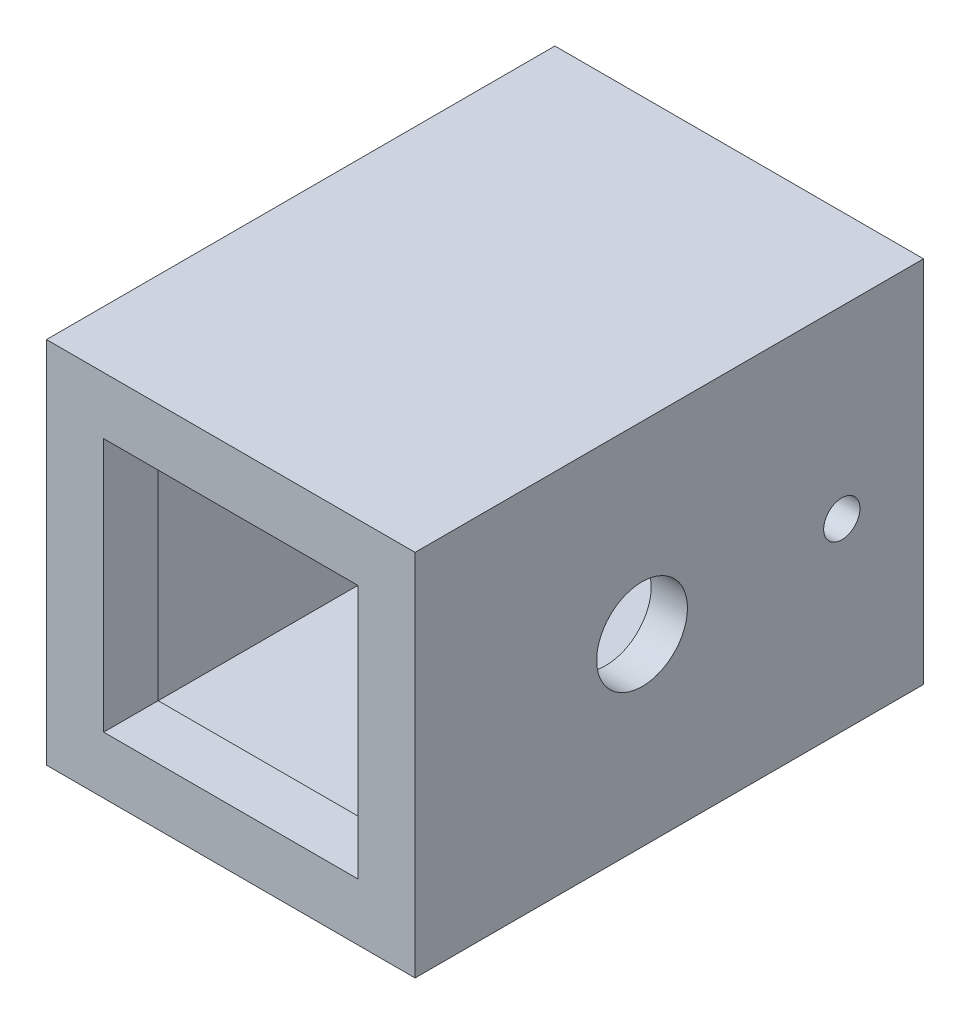
ISO-10303-21;
HEADER;
FILE_DESCRIPTION(('STEP AP214'),'2;1');
FILE_NAME('part.step','',(''),(''),'','','');
FILE_SCHEMA(('AUTOMOTIVE_DESIGN { 1 0 10303 214 1 1 1 1 }'));
ENDSEC;
DATA;
#1=APPLICATION_CONTEXT('core data for automotive mechanical design processes');
#2=APPLICATION_PROTOCOL_DEFINITION('international standard','automotive_design',2000,#1);
#3=PRODUCT_CONTEXT('',#1,'mechanical');
#4=PRODUCT('Part','Part','',(#3));
#5=PRODUCT_RELATED_PRODUCT_CATEGORY('part','',(#4));
#6=PRODUCT_DEFINITION_FORMATION('','',#4);
#7=PRODUCT_DEFINITION_CONTEXT('part definition',#1,'design');
#8=PRODUCT_DEFINITION('design','',#6,#7);
#9=PRODUCT_DEFINITION_SHAPE('','',#8);
#10=(LENGTH_UNIT() NAMED_UNIT(*) SI_UNIT(.MILLI.,.METRE.));
#11=(NAMED_UNIT(*) PLANE_ANGLE_UNIT() SI_UNIT($,.RADIAN.));
#12=(NAMED_UNIT(*) SI_UNIT($,.STERADIAN.) SOLID_ANGLE_UNIT());
#13=UNCERTAINTY_MEASURE_WITH_UNIT(LENGTH_MEASURE(1.E-05),#10,'distance_accuracy_value','');
#14=(GEOMETRIC_REPRESENTATION_CONTEXT(3) GLOBAL_UNCERTAINTY_ASSIGNED_CONTEXT((#13)) GLOBAL_UNIT_ASSIGNED_CONTEXT((#10,
#11,#12)) REPRESENTATION_CONTEXT('',''));
#15=CARTESIAN_POINT('',(0.,0.,0.));
#16=DIRECTION('',(0.,0.,1.));
#17=DIRECTION('',(1.,0.,0.));
#18=AXIS2_PLACEMENT_3D('',#15,#16,#17);
#19=CARTESIAN_POINT('',(10.15,-10.15,-25.));
#20=DIRECTION('',(1.,0.,0.));
#21=DIRECTION('',(0.,0.,-1.));
#22=AXIS2_PLACEMENT_3D('',#19,#20,#21);
#23=PLANE('',#22);
#24=CARTESIAN_POINT('',(10.15,0.,-20.5));
#25=DIRECTION('',(1.,0.,0.));
#26=DIRECTION('',(0.,0.,-1.));
#27=AXIS2_PLACEMENT_3D('',#24,#25,#26);
#28=CIRCLE('',#27,1.);
#29=CARTESIAN_POINT('',(10.15,0.,-21.5));
#30=VERTEX_POINT('',#29);
#31=EDGE_CURVE('E279',#30,#30,#28,.T.);
#32=ORIENTED_EDGE('',*,*,#31,.F.);
#33=EDGE_LOOP('',(#32));
#34=FACE_BOUND('',#33,.T.);
#35=CARTESIAN_POINT('',(10.15,0.,-9.5));
#36=DIRECTION('',(1.,0.,0.));
#37=DIRECTION('',(0.,0.,-1.));
#38=AXIS2_PLACEMENT_3D('',#35,#36,#37);
#39=CIRCLE('',#38,2.5);
#40=CARTESIAN_POINT('',(10.15,0.,-12.));
#41=VERTEX_POINT('',#40);
#42=EDGE_CURVE('E274',#41,#41,#39,.T.);
#43=ORIENTED_EDGE('',*,*,#42,.F.);
#44=EDGE_LOOP('',(#43));
#45=FACE_BOUND('',#44,.T.);
#46=DIRECTION('',(0.,0.,1.));
#47=VECTOR('',#46,1.);
#48=CARTESIAN_POINT('',(10.15,10.15,-25.));
#49=LINE('',#48,#47);
#50=CARTESIAN_POINT('',(10.15,10.15,-25.));
#51=VERTEX_POINT('',#50);
#52=CARTESIAN_POINT('',(10.15,10.15,3.));
#53=VERTEX_POINT('',#52);
#54=EDGE_CURVE('E228',#51,#53,#49,.T.);
#55=ORIENTED_EDGE('',*,*,#54,.T.);
#56=DIRECTION('',(0.,1.,0.));
#57=VECTOR('',#56,1.);
#58=CARTESIAN_POINT('',(10.15,10.15,3.));
#59=LINE('',#58,#57);
#60=CARTESIAN_POINT('',(10.15,-10.15,3.));
#61=VERTEX_POINT('',#60);
#62=EDGE_CURVE('E159',#61,#53,#59,.T.);
#63=ORIENTED_EDGE('',*,*,#62,.F.);
#64=DIRECTION('',(0.,0.,1.));
#65=VECTOR('',#64,1.);
#66=CARTESIAN_POINT('',(10.15,-10.15,-25.));
#67=LINE('',#66,#65);
#68=CARTESIAN_POINT('',(10.15,-10.15,-25.));
#69=VERTEX_POINT('',#68);
#70=EDGE_CURVE('E229',#69,#61,#67,.T.);
#71=ORIENTED_EDGE('',*,*,#70,.F.);
#72=DIRECTION('',(0.,1.,0.));
#73=VECTOR('',#72,1.);
#74=CARTESIAN_POINT('',(10.15,-10.15,-25.));
#75=LINE('',#74,#73);
#76=EDGE_CURVE('E211',#69,#51,#75,.T.);
#77=ORIENTED_EDGE('',*,*,#76,.T.);
#78=EDGE_LOOP('',(#55,#63,#71,#77));
#79=FACE_BOUND('',#78,.T.);
#80=ADVANCED_FACE('F39',(#34,#45,#79),#23,.T.);
#81=CARTESIAN_POINT('',(-10.15,-10.15,-25.));
#82=DIRECTION('',(0.,-1.,0.));
#83=DIRECTION('',(0.,0.,-1.));
#84=AXIS2_PLACEMENT_3D('',#81,#82,#83);
#85=PLANE('',#84);
#86=ORIENTED_EDGE('',*,*,#70,.T.);
#87=DIRECTION('',(1.,0.,0.));
#88=VECTOR('',#87,1.);
#89=CARTESIAN_POINT('',(10.15,-10.15,3.));
#90=LINE('',#89,#88);
#91=CARTESIAN_POINT('',(-10.15,-10.15,3.));
#92=VERTEX_POINT('',#91);
#93=EDGE_CURVE('E193',#92,#61,#90,.T.);
#94=ORIENTED_EDGE('',*,*,#93,.F.);
#95=DIRECTION('',(0.,0.,1.));
#96=VECTOR('',#95,1.);
#97=CARTESIAN_POINT('',(-10.15,-10.15,-25.));
#98=LINE('',#97,#96);
#99=CARTESIAN_POINT('',(-10.15,-10.15,-25.));
#100=VERTEX_POINT('',#99);
#101=EDGE_CURVE('E232',#100,#92,#98,.T.);
#102=ORIENTED_EDGE('',*,*,#101,.F.);
#103=DIRECTION('',(1.,0.,0.));
#104=VECTOR('',#103,1.);
#105=CARTESIAN_POINT('',(-10.15,-10.15,-25.));
#106=LINE('',#105,#104);
#107=EDGE_CURVE('E225',#100,#69,#106,.T.);
#108=ORIENTED_EDGE('',*,*,#107,.T.);
#109=EDGE_LOOP('',(#86,#94,#102,#108));
#110=FACE_BOUND('',#109,.T.);
#111=ADVANCED_FACE('F309',(#110),#85,.T.);
#112=CARTESIAN_POINT('',(-10.15,-10.15,-25.));
#113=DIRECTION('',(-1.,0.,0.));
#114=DIRECTION('',(0.,0.,1.));
#115=AXIS2_PLACEMENT_3D('',#112,#113,#114);
#116=PLANE('',#115);
#117=CARTESIAN_POINT('',(-10.15,0.,-20.5));
#118=DIRECTION('',(1.,0.,0.));
#119=DIRECTION('',(0.,0.,-1.));
#120=AXIS2_PLACEMENT_3D('',#117,#118,#119);
#121=CIRCLE('',#120,1.);
#122=CARTESIAN_POINT('',(-10.15,0.,-21.5));
#123=VERTEX_POINT('',#122);
#124=EDGE_CURVE('E241',#123,#123,#121,.T.);
#125=ORIENTED_EDGE('',*,*,#124,.T.);
#126=EDGE_LOOP('',(#125));
#127=FACE_BOUND('',#126,.T.);
#128=CARTESIAN_POINT('',(-10.15,0.,-9.5));
#129=DIRECTION('',(1.,0.,0.));
#130=DIRECTION('',(0.,0.,-1.));
#131=AXIS2_PLACEMENT_3D('',#128,#129,#130);
#132=CIRCLE('',#131,2.5);
#133=CARTESIAN_POINT('',(-10.15,0.,-12.));
#134=VERTEX_POINT('',#133);
#135=EDGE_CURVE('E269',#134,#134,#132,.T.);
#136=ORIENTED_EDGE('',*,*,#135,.T.);
#137=EDGE_LOOP('',(#136));
#138=FACE_BOUND('',#137,.T.);
#139=ORIENTED_EDGE('',*,*,#101,.T.);
#140=DIRECTION('',(0.,-1.,0.));
#141=VECTOR('',#140,1.);
#142=CARTESIAN_POINT('',(-10.15,10.15,3.));
#143=LINE('',#142,#141);
#144=CARTESIAN_POINT('',(-10.15,10.15,3.));
#145=VERTEX_POINT('',#144);
#146=EDGE_CURVE('E190',#145,#92,#143,.T.);
#147=ORIENTED_EDGE('',*,*,#146,.F.);
#148=DIRECTION('',(0.,0.,1.));
#149=VECTOR('',#148,1.);
#150=CARTESIAN_POINT('',(-10.15,10.15,-25.));
#151=LINE('',#150,#149);
#152=CARTESIAN_POINT('',(-10.15,10.15,-25.));
#153=VERTEX_POINT('',#152);
#154=EDGE_CURVE('E234',#153,#145,#151,.T.);
#155=ORIENTED_EDGE('',*,*,#154,.F.);
#156=DIRECTION('',(0.,-1.,0.));
#157=VECTOR('',#156,1.);
#158=CARTESIAN_POINT('',(-10.15,-10.15,-25.));
#159=LINE('',#158,#157);
#160=EDGE_CURVE('E222',#153,#100,#159,.T.);
#161=ORIENTED_EDGE('',*,*,#160,.T.);
#162=EDGE_LOOP('',(#139,#147,#155,#161));
#163=FACE_BOUND('',#162,.T.);
#164=ADVANCED_FACE('F315',(#127,#138,#163),#116,.T.);
#165=CARTESIAN_POINT('',(-10.15,10.15,-25.));
#166=DIRECTION('',(0.,1.,0.));
#167=DIRECTION('',(0.,0.,1.));
#168=AXIS2_PLACEMENT_3D('',#165,#166,#167);
#169=PLANE('',#168);
#170=ORIENTED_EDGE('',*,*,#154,.T.);
#171=DIRECTION('',(-1.,0.,0.));
#172=VECTOR('',#171,1.);
#173=CARTESIAN_POINT('',(10.15,10.15,3.));
#174=LINE('',#173,#172);
#175=EDGE_CURVE('E187',#53,#145,#174,.T.);
#176=ORIENTED_EDGE('',*,*,#175,.F.);
#177=ORIENTED_EDGE('',*,*,#54,.F.);
#178=DIRECTION('',(-1.,0.,0.));
#179=VECTOR('',#178,1.);
#180=CARTESIAN_POINT('',(-10.15,10.15,-25.));
#181=LINE('',#180,#179);
#182=EDGE_CURVE('E219',#51,#153,#181,.T.);
#183=ORIENTED_EDGE('',*,*,#182,.T.);
#184=EDGE_LOOP('',(#170,#176,#177,#183));
#185=FACE_BOUND('',#184,.T.);
#186=ADVANCED_FACE('F322',(#185),#169,.T.);
#187=CARTESIAN_POINT('',(0.,0.,-25.));
#188=DIRECTION('',(0.,0.,-1.));
#189=DIRECTION('',(-1.,0.,0.));
#190=AXIS2_PLACEMENT_3D('',#187,#188,#189);
#191=PLANE('',#190);
#192=DIRECTION('',(-1.,0.,0.));
#193=VECTOR('',#192,1.);
#194=CARTESIAN_POINT('',(-8.15,9.15,-25.));
#195=LINE('',#194,#193);
#196=CARTESIAN_POINT('',(9.15,9.15,-25.));
#197=VERTEX_POINT('',#196);
#198=CARTESIAN_POINT('',(-9.15,9.15,-25.));
#199=VERTEX_POINT('',#198);
#200=EDGE_CURVE('E231',#197,#199,#195,.T.);
#201=ORIENTED_EDGE('',*,*,#200,.T.);
#202=DIRECTION('',(0.,-1.,0.));
#203=VECTOR('',#202,1.);
#204=CARTESIAN_POINT('',(-9.15,-8.15,-25.));
#205=LINE('',#204,#203);
#206=CARTESIAN_POINT('',(-9.15,-9.15,-25.));
#207=VERTEX_POINT('',#206);
#208=EDGE_CURVE('E250',#199,#207,#205,.T.);
#209=ORIENTED_EDGE('',*,*,#208,.T.);
#210=DIRECTION('',(1.,0.,0.));
#211=VECTOR('',#210,1.);
#212=CARTESIAN_POINT('',(8.15,-9.15,-25.));
#213=LINE('',#212,#211);
#214=CARTESIAN_POINT('',(9.15,-9.15,-25.));
#215=VERTEX_POINT('',#214);
#216=EDGE_CURVE('E248',#207,#215,#213,.T.);
#217=ORIENTED_EDGE('',*,*,#216,.T.);
#218=DIRECTION('',(0.,1.,0.));
#219=VECTOR('',#218,1.);
#220=CARTESIAN_POINT('',(9.15,8.15,-25.));
#221=LINE('',#220,#219);
#222=EDGE_CURVE('E246',#215,#197,#221,.T.);
#223=ORIENTED_EDGE('',*,*,#222,.T.);
#224=EDGE_LOOP('',(#201,#209,#217,#223));
#225=FACE_BOUND('',#224,.T.);
#226=ORIENTED_EDGE('',*,*,#76,.F.);
#227=ORIENTED_EDGE('',*,*,#107,.F.);
#228=ORIENTED_EDGE('',*,*,#160,.F.);
#229=ORIENTED_EDGE('',*,*,#182,.F.);
#230=EDGE_LOOP('',(#226,#227,#228,#229));
#231=FACE_BOUND('',#230,.T.);
#232=ADVANCED_FACE('F465',(#225,#231),#191,.T.);
#233=CARTESIAN_POINT('',(8.15,-8.15,-25.));
#234=DIRECTION('',(1.,0.,0.));
#235=DIRECTION('',(0.,0.,-1.));
#236=AXIS2_PLACEMENT_3D('',#233,#234,#235);
#237=PLANE('',#236);
#238=CARTESIAN_POINT('',(8.15,0.,-20.5));
#239=DIRECTION('',(1.,0.,0.));
#240=DIRECTION('',(0.,0.,-1.));
#241=AXIS2_PLACEMENT_3D('',#238,#239,#240);
#242=CIRCLE('',#241,1.);
#243=CARTESIAN_POINT('',(8.15,0.,-21.5));
#244=VERTEX_POINT('',#243);
#245=EDGE_CURVE('E174',#244,#244,#242,.T.);
#246=ORIENTED_EDGE('',*,*,#245,.T.);
#247=EDGE_LOOP('',(#246));
#248=FACE_BOUND('',#247,.T.);
#249=CARTESIAN_POINT('',(8.15,0.,-9.5));
#250=DIRECTION('',(1.,0.,0.));
#251=DIRECTION('',(0.,0.,-1.));
#252=AXIS2_PLACEMENT_3D('',#249,#250,#251);
#253=CIRCLE('',#252,2.5);
#254=CARTESIAN_POINT('',(8.15,0.,-12.));
#255=VERTEX_POINT('',#254);
#256=EDGE_CURVE('E240',#255,#255,#253,.T.);
#257=ORIENTED_EDGE('',*,*,#256,.T.);
#258=EDGE_LOOP('',(#257));
#259=FACE_BOUND('',#258,.T.);
#260=DIRECTION('',(0.,0.,1.));
#261=VECTOR('',#260,1.);
#262=CARTESIAN_POINT('',(8.15,8.15,-25.));
#263=LINE('',#262,#261);
#264=CARTESIAN_POINT('',(8.15,8.15,-24.));
#265=VERTEX_POINT('',#264);
#266=CARTESIAN_POINT('',(8.15,8.15,0.));
#267=VERTEX_POINT('',#266);
#268=EDGE_CURVE('E208',#265,#267,#263,.T.);
#269=ORIENTED_EDGE('',*,*,#268,.F.);
#270=DIRECTION('',(0.,1.,0.));
#271=VECTOR('',#270,1.);
#272=CARTESIAN_POINT('',(8.15,-8.15,-24.));
#273=LINE('',#272,#271);
#274=CARTESIAN_POINT('',(8.15,-8.15,-24.));
#275=VERTEX_POINT('',#274);
#276=EDGE_CURVE('E48',#265,#275,#273,.F.);
#277=ORIENTED_EDGE('',*,*,#276,.T.);
#278=DIRECTION('',(0.,0.,1.));
#279=VECTOR('',#278,1.);
#280=CARTESIAN_POINT('',(8.15,-8.15,-25.));
#281=LINE('',#280,#279);
#282=CARTESIAN_POINT('',(8.15,-8.15,0.));
#283=VERTEX_POINT('',#282);
#284=EDGE_CURVE('E209',#275,#283,#281,.T.);
#285=ORIENTED_EDGE('',*,*,#284,.T.);
#286=DIRECTION('',(0.,1.,0.));
#287=VECTOR('',#286,1.);
#288=CARTESIAN_POINT('',(8.15,-8.15,0.));
#289=LINE('',#288,#287);
#290=EDGE_CURVE('E196',#283,#267,#289,.T.);
#291=ORIENTED_EDGE('',*,*,#290,.T.);
#292=EDGE_LOOP('',(#269,#277,#285,#291));
#293=FACE_BOUND('',#292,.T.);
#294=ADVANCED_FACE('F287',(#248,#259,#293),#237,.F.);
#295=CARTESIAN_POINT('',(-8.15,-8.15,-25.));
#296=DIRECTION('',(0.,-1.,0.));
#297=DIRECTION('',(0.,0.,-1.));
#298=AXIS2_PLACEMENT_3D('',#295,#296,#297);
#299=PLANE('',#298);
#300=ORIENTED_EDGE('',*,*,#284,.F.);
#301=DIRECTION('',(1.,0.,0.));
#302=VECTOR('',#301,1.);
#303=CARTESIAN_POINT('',(-8.15,-8.15,-24.));
#304=LINE('',#303,#302);
#305=CARTESIAN_POINT('',(-8.15,-8.15,-24.));
#306=VERTEX_POINT('',#305);
#307=EDGE_CURVE('E256',#275,#306,#304,.F.);
#308=ORIENTED_EDGE('',*,*,#307,.T.);
#309=DIRECTION('',(0.,0.,1.));
#310=VECTOR('',#309,1.);
#311=CARTESIAN_POINT('',(-8.15,-8.15,-25.));
#312=LINE('',#311,#310);
#313=CARTESIAN_POINT('',(-8.15,-8.15,0.));
#314=VERTEX_POINT('',#313);
#315=EDGE_CURVE('E212',#306,#314,#312,.T.);
#316=ORIENTED_EDGE('',*,*,#315,.T.);
#317=DIRECTION('',(1.,0.,0.));
#318=VECTOR('',#317,1.);
#319=CARTESIAN_POINT('',(-8.15,-8.15,0.));
#320=LINE('',#319,#318);
#321=EDGE_CURVE('E205',#314,#283,#320,.T.);
#322=ORIENTED_EDGE('',*,*,#321,.T.);
#323=EDGE_LOOP('',(#300,#308,#316,#322));
#324=FACE_BOUND('',#323,.T.);
#325=ADVANCED_FACE('F513',(#324),#299,.F.);
#326=CARTESIAN_POINT('',(-8.15,-8.15,-25.));
#327=DIRECTION('',(-1.,0.,0.));
#328=DIRECTION('',(0.,0.,1.));
#329=AXIS2_PLACEMENT_3D('',#326,#327,#328);
#330=PLANE('',#329);
#331=CARTESIAN_POINT('',(-8.15,0.,-20.5));
#332=DIRECTION('',(-1.,0.,0.));
#333=DIRECTION('',(0.,0.,1.));
#334=AXIS2_PLACEMENT_3D('',#331,#332,#333);
#335=CIRCLE('',#334,1.);
#336=CARTESIAN_POINT('',(-8.15,0.,-19.5));
#337=VERTEX_POINT('',#336);
#338=EDGE_CURVE('E242',#337,#337,#335,.T.);
#339=ORIENTED_EDGE('',*,*,#338,.T.);
#340=EDGE_LOOP('',(#339));
#341=FACE_BOUND('',#340,.T.);
#342=CARTESIAN_POINT('',(-8.15,0.,-9.5));
#343=DIRECTION('',(-1.,0.,0.));
#344=DIRECTION('',(0.,0.,1.));
#345=AXIS2_PLACEMENT_3D('',#342,#343,#344);
#346=CIRCLE('',#345,2.5);
#347=CARTESIAN_POINT('',(-8.15,0.,-7.));
#348=VERTEX_POINT('',#347);
#349=EDGE_CURVE('E237',#348,#348,#346,.T.);
#350=ORIENTED_EDGE('',*,*,#349,.T.);
#351=EDGE_LOOP('',(#350));
#352=FACE_BOUND('',#351,.T.);
#353=ORIENTED_EDGE('',*,*,#315,.F.);
#354=DIRECTION('',(0.,-1.,0.));
#355=VECTOR('',#354,1.);
#356=CARTESIAN_POINT('',(-8.15,8.15,-24.));
#357=LINE('',#356,#355);
#358=CARTESIAN_POINT('',(-8.15,8.15,-24.));
#359=VERTEX_POINT('',#358);
#360=EDGE_CURVE('E253',#306,#359,#357,.F.);
#361=ORIENTED_EDGE('',*,*,#360,.T.);
#362=DIRECTION('',(0.,0.,1.));
#363=VECTOR('',#362,1.);
#364=CARTESIAN_POINT('',(-8.15,8.15,-25.));
#365=LINE('',#364,#363);
#366=CARTESIAN_POINT('',(-8.15,8.15,0.));
#367=VERTEX_POINT('',#366);
#368=EDGE_CURVE('E214',#359,#367,#365,.T.);
#369=ORIENTED_EDGE('',*,*,#368,.T.);
#370=DIRECTION('',(0.,-1.,0.));
#371=VECTOR('',#370,1.);
#372=CARTESIAN_POINT('',(-8.15,-8.15,0.));
#373=LINE('',#372,#371);
#374=EDGE_CURVE('E202',#367,#314,#373,.T.);
#375=ORIENTED_EDGE('',*,*,#374,.T.);
#376=EDGE_LOOP('',(#353,#361,#369,#375));
#377=FACE_BOUND('',#376,.T.);
#378=ADVANCED_FACE('F503',(#341,#352,#377),#330,.F.);
#379=CARTESIAN_POINT('',(-8.15,8.15,-25.));
#380=DIRECTION('',(0.,1.,0.));
#381=DIRECTION('',(0.,0.,1.));
#382=AXIS2_PLACEMENT_3D('',#379,#380,#381);
#383=PLANE('',#382);
#384=ORIENTED_EDGE('',*,*,#368,.F.);
#385=DIRECTION('',(-1.,0.,0.));
#386=VECTOR('',#385,1.);
#387=CARTESIAN_POINT('',(8.15,8.15,-24.));
#388=LINE('',#387,#386);
#389=EDGE_CURVE('E11',#359,#265,#388,.F.);
#390=ORIENTED_EDGE('',*,*,#389,.T.);
#391=ORIENTED_EDGE('',*,*,#268,.T.);
#392=DIRECTION('',(-1.,0.,0.));
#393=VECTOR('',#392,1.);
#394=CARTESIAN_POINT('',(-8.15,8.15,0.));
#395=LINE('',#394,#393);
#396=EDGE_CURVE('E199',#267,#367,#395,.T.);
#397=ORIENTED_EDGE('',*,*,#396,.T.);
#398=EDGE_LOOP('',(#384,#390,#391,#397));
#399=FACE_BOUND('',#398,.T.);
#400=ADVANCED_FACE('F453',(#399),#383,.F.);
#401=CARTESIAN_POINT('',(0.,0.,0.));
#402=DIRECTION('',(0.,0.,-1.));
#403=DIRECTION('',(-1.,0.,0.));
#404=AXIS2_PLACEMENT_3D('',#401,#402,#403);
#405=PLANE('',#404);
#406=DIRECTION('',(1.,0.,0.));
#407=VECTOR('',#406,1.);
#408=CARTESIAN_POINT('',(-7.00000000000009,-6.99999999999991,0.));
#409=LINE('',#408,#407);
#410=CARTESIAN_POINT('',(-7.00000000000009,-6.99999999999991,0.));
#411=VERTEX_POINT('',#410);
#412=CARTESIAN_POINT('',(7.00000000000009,-6.99999999999991,0.));
#413=VERTEX_POINT('',#412);
#414=EDGE_CURVE('E152',#411,#413,#409,.T.);
#415=ORIENTED_EDGE('',*,*,#414,.T.);
#416=DIRECTION('',(0.,1.,0.));
#417=VECTOR('',#416,1.);
#418=CARTESIAN_POINT('',(7.00000000000009,-6.99999999999991,0.));
#419=LINE('',#418,#417);
#420=CARTESIAN_POINT('',(7.00000000000009,6.99999999999991,0.));
#421=VERTEX_POINT('',#420);
#422=EDGE_CURVE('E172',#413,#421,#419,.T.);
#423=ORIENTED_EDGE('',*,*,#422,.T.);
#424=DIRECTION('',(-1.,0.,0.));
#425=VECTOR('',#424,1.);
#426=CARTESIAN_POINT('',(-7.00000000000009,6.99999999999991,0.));
#427=LINE('',#426,#425);
#428=CARTESIAN_POINT('',(-7.00000000000009,6.99999999999991,0.));
#429=VERTEX_POINT('',#428);
#430=EDGE_CURVE('E158',#421,#429,#427,.T.);
#431=ORIENTED_EDGE('',*,*,#430,.T.);
#432=DIRECTION('',(0.,-1.,0.));
#433=VECTOR('',#432,1.);
#434=CARTESIAN_POINT('',(-7.00000000000009,-6.99999999999991,0.));
#435=LINE('',#434,#433);
#436=EDGE_CURVE('E176',#429,#411,#435,.T.);
#437=ORIENTED_EDGE('',*,*,#436,.T.);
#438=EDGE_LOOP('',(#415,#423,#431,#437));
#439=FACE_BOUND('',#438,.T.);
#440=ORIENTED_EDGE('',*,*,#396,.F.);
#441=ORIENTED_EDGE('',*,*,#290,.F.);
#442=ORIENTED_EDGE('',*,*,#321,.F.);
#443=ORIENTED_EDGE('',*,*,#374,.F.);
#444=EDGE_LOOP('',(#440,#441,#442,#443));
#445=FACE_BOUND('',#444,.T.);
#446=ADVANCED_FACE('F442',(#439,#445),#405,.T.);
#447=CARTESIAN_POINT('',(0.,0.,3.));
#448=DIRECTION('',(0.,0.,-1.));
#449=DIRECTION('',(-1.,0.,0.));
#450=AXIS2_PLACEMENT_3D('',#447,#448,#449);
#451=PLANE('',#450);
#452=ORIENTED_EDGE('',*,*,#62,.T.);
#453=ORIENTED_EDGE('',*,*,#175,.T.);
#454=ORIENTED_EDGE('',*,*,#146,.T.);
#455=ORIENTED_EDGE('',*,*,#93,.T.);
#456=EDGE_LOOP('',(#452,#453,#454,#455));
#457=FACE_BOUND('',#456,.T.);
#458=DIRECTION('',(0.,1.,0.));
#459=VECTOR('',#458,1.);
#460=CARTESIAN_POINT('',(7.00000000000009,-6.99999999999991,3.));
#461=LINE('',#460,#459);
#462=CARTESIAN_POINT('',(7.00000000000009,-6.99999999999991,3.));
#463=VERTEX_POINT('',#462);
#464=CARTESIAN_POINT('',(7.00000000000009,6.99999999999991,3.));
#465=VERTEX_POINT('',#464);
#466=EDGE_CURVE('E141',#463,#465,#461,.T.);
#467=ORIENTED_EDGE('',*,*,#466,.F.);
#468=DIRECTION('',(1.,0.,0.));
#469=VECTOR('',#468,1.);
#470=CARTESIAN_POINT('',(-7.00000000000009,-6.99999999999991,3.));
#471=LINE('',#470,#469);
#472=CARTESIAN_POINT('',(-7.00000000000009,-6.99999999999991,3.));
#473=VERTEX_POINT('',#472);
#474=EDGE_CURVE('E167',#473,#463,#471,.T.);
#475=ORIENTED_EDGE('',*,*,#474,.F.);
#476=DIRECTION('',(0.,-1.,0.));
#477=VECTOR('',#476,1.);
#478=CARTESIAN_POINT('',(-7.00000000000009,-6.99999999999991,3.));
#479=LINE('',#478,#477);
#480=CARTESIAN_POINT('',(-7.00000000000009,6.99999999999991,3.));
#481=VERTEX_POINT('',#480);
#482=EDGE_CURVE('E165',#481,#473,#479,.T.);
#483=ORIENTED_EDGE('',*,*,#482,.F.);
#484=DIRECTION('',(-1.,0.,0.));
#485=VECTOR('',#484,1.);
#486=CARTESIAN_POINT('',(-7.00000000000009,6.99999999999991,3.));
#487=LINE('',#486,#485);
#488=EDGE_CURVE('E151',#465,#481,#487,.T.);
#489=ORIENTED_EDGE('',*,*,#488,.F.);
#490=EDGE_LOOP('',(#467,#475,#483,#489));
#491=FACE_BOUND('',#490,.T.);
#492=ADVANCED_FACE('F163',(#457,#491),#451,.F.);
#493=CARTESIAN_POINT('',(7.00000000000009,-6.99999999999991,3.));
#494=DIRECTION('',(-1.,0.,0.));
#495=DIRECTION('',(0.,0.,1.));
#496=AXIS2_PLACEMENT_3D('',#493,#494,#495);
#497=PLANE('',#496);
#498=ORIENTED_EDGE('',*,*,#422,.F.);
#499=DIRECTION('',(0.,0.,-1.));
#500=VECTOR('',#499,1.);
#501=CARTESIAN_POINT('',(7.00000000000009,-6.99999999999991,3.));
#502=LINE('',#501,#500);
#503=EDGE_CURVE('E147',#463,#413,#502,.T.);
#504=ORIENTED_EDGE('',*,*,#503,.F.);
#505=ORIENTED_EDGE('',*,*,#466,.T.);
#506=DIRECTION('',(0.,0.,-1.));
#507=VECTOR('',#506,1.);
#508=CARTESIAN_POINT('',(7.00000000000009,6.99999999999991,3.));
#509=LINE('',#508,#507);
#510=EDGE_CURVE('E144',#465,#421,#509,.T.);
#511=ORIENTED_EDGE('',*,*,#510,.T.);
#512=EDGE_LOOP('',(#498,#504,#505,#511));
#513=FACE_BOUND('',#512,.T.);
#514=ADVANCED_FACE('F143',(#513),#497,.T.);
#515=CARTESIAN_POINT('',(-7.00000000000009,6.99999999999991,3.));
#516=DIRECTION('',(0.,-1.,0.));
#517=DIRECTION('',(0.,0.,-1.));
#518=AXIS2_PLACEMENT_3D('',#515,#516,#517);
#519=PLANE('',#518);
#520=ORIENTED_EDGE('',*,*,#430,.F.);
#521=ORIENTED_EDGE('',*,*,#510,.F.);
#522=ORIENTED_EDGE('',*,*,#488,.T.);
#523=DIRECTION('',(0.,0.,-1.));
#524=VECTOR('',#523,1.);
#525=CARTESIAN_POINT('',(-7.00000000000009,6.99999999999991,3.));
#526=LINE('',#525,#524);
#527=EDGE_CURVE('E160',#481,#429,#526,.T.);
#528=ORIENTED_EDGE('',*,*,#527,.T.);
#529=EDGE_LOOP('',(#520,#521,#522,#528));
#530=FACE_BOUND('',#529,.T.);
#531=ADVANCED_FACE('F155',(#530),#519,.T.);
#532=CARTESIAN_POINT('',(-7.00000000000009,-6.99999999999991,3.));
#533=DIRECTION('',(1.,0.,0.));
#534=DIRECTION('',(0.,0.,-1.));
#535=AXIS2_PLACEMENT_3D('',#532,#533,#534);
#536=PLANE('',#535);
#537=ORIENTED_EDGE('',*,*,#436,.F.);
#538=ORIENTED_EDGE('',*,*,#527,.F.);
#539=ORIENTED_EDGE('',*,*,#482,.T.);
#540=DIRECTION('',(0.,0.,-1.));
#541=VECTOR('',#540,1.);
#542=CARTESIAN_POINT('',(-7.00000000000009,-6.99999999999991,3.));
#543=LINE('',#542,#541);
#544=EDGE_CURVE('E182',#473,#411,#543,.T.);
#545=ORIENTED_EDGE('',*,*,#544,.T.);
#546=EDGE_LOOP('',(#537,#538,#539,#545));
#547=FACE_BOUND('',#546,.T.);
#548=ADVANCED_FACE('F403',(#547),#536,.T.);
#549=CARTESIAN_POINT('',(-7.00000000000009,-6.99999999999991,3.));
#550=DIRECTION('',(0.,1.,0.));
#551=DIRECTION('',(0.,0.,1.));
#552=AXIS2_PLACEMENT_3D('',#549,#550,#551);
#553=PLANE('',#552);
#554=ORIENTED_EDGE('',*,*,#414,.F.);
#555=ORIENTED_EDGE('',*,*,#544,.F.);
#556=ORIENTED_EDGE('',*,*,#474,.T.);
#557=ORIENTED_EDGE('',*,*,#503,.T.);
#558=EDGE_LOOP('',(#554,#555,#556,#557));
#559=FACE_BOUND('',#558,.T.);
#560=ADVANCED_FACE('F392',(#559),#553,.T.);
#561=CARTESIAN_POINT('',(-10.15,0.,-9.5));
#562=DIRECTION('',(1.,0.,0.));
#563=DIRECTION('',(0.,0.,-1.));
#564=AXIS2_PLACEMENT_3D('',#561,#562,#563);
#565=CYLINDRICAL_SURFACE('',#564,2.5);
#566=ORIENTED_EDGE('',*,*,#135,.F.);
#567=EDGE_LOOP('',(#566));
#568=FACE_BOUND('',#567,.T.);
#569=ORIENTED_EDGE('',*,*,#349,.F.);
#570=EDGE_LOOP('',(#569));
#571=FACE_BOUND('',#570,.T.);
#572=ADVANCED_FACE('F304',(#568,#571),#565,.F.);
#573=CARTESIAN_POINT('',(-10.15,0.,-20.5));
#574=DIRECTION('',(1.,0.,0.));
#575=DIRECTION('',(0.,0.,-1.));
#576=AXIS2_PLACEMENT_3D('',#573,#574,#575);
#577=CYLINDRICAL_SURFACE('',#576,1.);
#578=ORIENTED_EDGE('',*,*,#124,.F.);
#579=EDGE_LOOP('',(#578));
#580=FACE_BOUND('',#579,.T.);
#581=ORIENTED_EDGE('',*,*,#338,.F.);
#582=EDGE_LOOP('',(#581));
#583=FACE_BOUND('',#582,.T.);
#584=ADVANCED_FACE('F295',(#580,#583),#577,.F.);
#585=ORIENTED_EDGE('',*,*,#42,.T.);
#586=EDGE_LOOP('',(#585));
#587=FACE_BOUND('',#586,.T.);
#588=ORIENTED_EDGE('',*,*,#256,.F.);
#589=EDGE_LOOP('',(#588));
#590=FACE_BOUND('',#589,.T.);
#591=ADVANCED_FACE('F292',(#587,#590),#565,.F.);
#592=ORIENTED_EDGE('',*,*,#31,.T.);
#593=EDGE_LOOP('',(#592));
#594=FACE_BOUND('',#593,.T.);
#595=ORIENTED_EDGE('',*,*,#245,.F.);
#596=EDGE_LOOP('',(#595));
#597=FACE_BOUND('',#596,.T.);
#598=ADVANCED_FACE('F290',(#594,#597),#577,.F.);
#599=CARTESIAN_POINT('',(9.15,0.,-24.));
#600=DIRECTION('',(0.,-1.,0.));
#601=DIRECTION('',(0.,0.,-1.));
#602=AXIS2_PLACEMENT_3D('',#599,#600,#601);
#603=CYLINDRICAL_SURFACE('',#602,1.);
#604=CARTESIAN_POINT('',(9.15,-9.15,-24.));
#605=DIRECTION('',(-0.707106781186547,-0.707106781186547,0.));
#606=DIRECTION('',(-0.707106781186547,0.707106781186547,0.));
#607=AXIS2_PLACEMENT_3D('',#604,#605,#606);
#608=ELLIPSE('',#607,1.41421356237309,1.);
#609=EDGE_CURVE('E262',#275,#215,#608,.T.);
#610=ORIENTED_EDGE('',*,*,#609,.F.);
#611=ORIENTED_EDGE('',*,*,#276,.F.);
#612=CARTESIAN_POINT('',(9.15,9.15,-24.));
#613=DIRECTION('',(0.707106781186547,-0.707106781186547,0.));
#614=DIRECTION('',(-0.707106781186547,-0.707106781186547,0.));
#615=AXIS2_PLACEMENT_3D('',#612,#613,#614);
#616=ELLIPSE('',#615,1.41421356237309,1.);
#617=EDGE_CURVE('E43',#197,#265,#616,.F.);
#618=ORIENTED_EDGE('',*,*,#617,.F.);
#619=ORIENTED_EDGE('',*,*,#222,.F.);
#620=EDGE_LOOP('',(#610,#611,#618,#619));
#621=FACE_BOUND('',#620,.T.);
#622=ADVANCED_FACE('F41',(#621),#603,.T.);
#623=CARTESIAN_POINT('',(0.,9.15,-24.));
#624=DIRECTION('',(1.,0.,0.));
#625=DIRECTION('',(0.,0.,-1.));
#626=AXIS2_PLACEMENT_3D('',#623,#624,#625);
#627=CYLINDRICAL_SURFACE('',#626,1.);
#628=ORIENTED_EDGE('',*,*,#617,.T.);
#629=ORIENTED_EDGE('',*,*,#389,.F.);
#630=CARTESIAN_POINT('',(-9.15,9.15,-24.));
#631=DIRECTION('',(0.707106781186547,0.707106781186547,0.));
#632=DIRECTION('',(-0.707106781186547,0.707106781186547,0.));
#633=AXIS2_PLACEMENT_3D('',#630,#631,#632);
#634=ELLIPSE('',#633,1.41421356237309,1.);
#635=EDGE_CURVE('E261',#199,#359,#634,.F.);
#636=ORIENTED_EDGE('',*,*,#635,.F.);
#637=ORIENTED_EDGE('',*,*,#200,.F.);
#638=EDGE_LOOP('',(#628,#629,#636,#637));
#639=FACE_BOUND('',#638,.T.);
#640=ADVANCED_FACE('F300',(#639),#627,.T.);
#641=CARTESIAN_POINT('',(0.,-9.15,-24.));
#642=DIRECTION('',(-1.,0.,0.));
#643=DIRECTION('',(0.,0.,1.));
#644=AXIS2_PLACEMENT_3D('',#641,#642,#643);
#645=CYLINDRICAL_SURFACE('',#644,1.);
#646=ORIENTED_EDGE('',*,*,#609,.T.);
#647=ORIENTED_EDGE('',*,*,#216,.F.);
#648=CARTESIAN_POINT('',(-9.15,-9.15,-24.));
#649=DIRECTION('',(-0.707106781186547,0.707106781186547,0.));
#650=DIRECTION('',(0.707106781186547,0.707106781186547,0.));
#651=AXIS2_PLACEMENT_3D('',#648,#649,#650);
#652=ELLIPSE('',#651,1.41421356237309,1.);
#653=EDGE_CURVE('E259',#306,#207,#652,.T.);
#654=ORIENTED_EDGE('',*,*,#653,.F.);
#655=ORIENTED_EDGE('',*,*,#307,.F.);
#656=EDGE_LOOP('',(#646,#647,#654,#655));
#657=FACE_BOUND('',#656,.T.);
#658=ADVANCED_FACE('F327',(#657),#645,.T.);
#659=CARTESIAN_POINT('',(-9.15,0.,-24.));
#660=DIRECTION('',(0.,1.,0.));
#661=DIRECTION('',(0.,0.,1.));
#662=AXIS2_PLACEMENT_3D('',#659,#660,#661);
#663=CYLINDRICAL_SURFACE('',#662,1.);
#664=ORIENTED_EDGE('',*,*,#635,.T.);
#665=ORIENTED_EDGE('',*,*,#360,.F.);
#666=ORIENTED_EDGE('',*,*,#653,.T.);
#667=ORIENTED_EDGE('',*,*,#208,.F.);
#668=EDGE_LOOP('',(#664,#665,#666,#667));
#669=FACE_BOUND('',#668,.T.);
#670=ADVANCED_FACE('F324',(#669),#663,.T.);
#671=CLOSED_SHELL('',(#80,#111,#164,#186,#232,#294,#325,#378,#400,#446,#492,#514,#531,#548,#560,
#572,#584,#591,#598,#622,#640,#658,#670));
#672=MANIFOLD_SOLID_BREP('B2',#671);
#673=ADVANCED_BREP_SHAPE_REPRESENTATION('',(#18,#672),#14);
#674=SHAPE_DEFINITION_REPRESENTATION(#9,#673);
ENDSEC;
END-ISO-10303-21;
